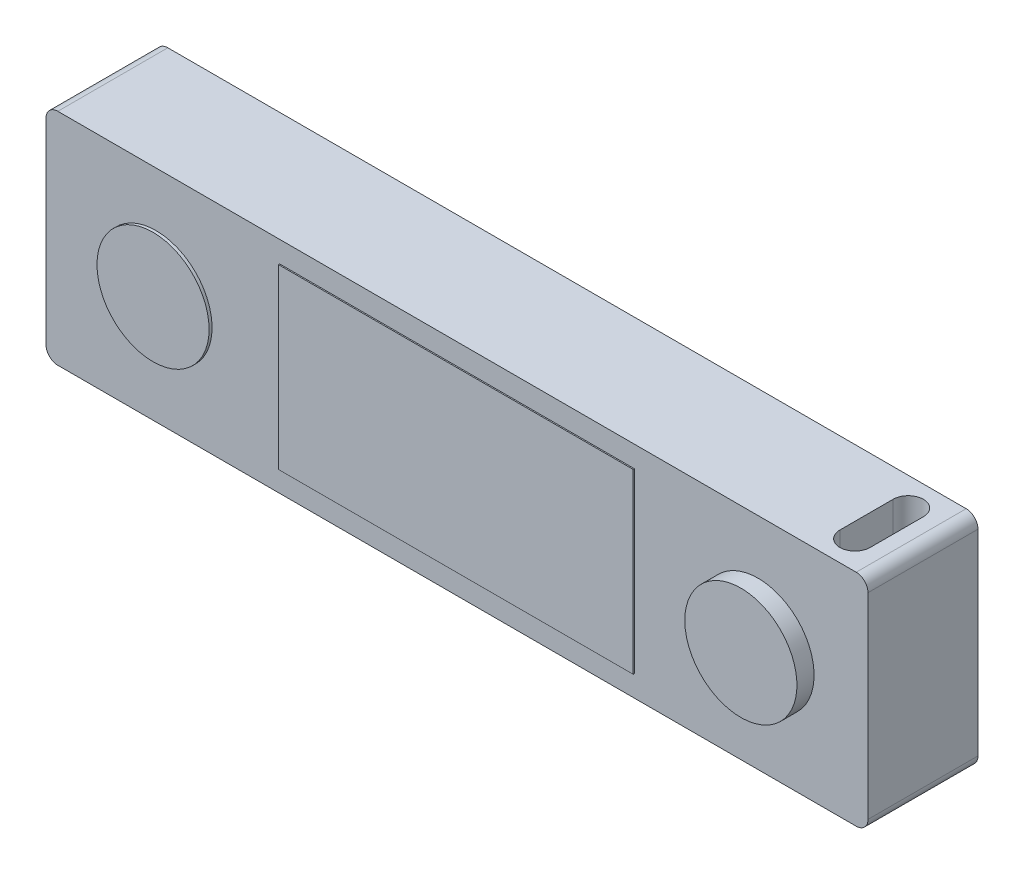
ISO-10303-21;
HEADER;
FILE_DESCRIPTION(('STEP AP214'),'2;1');
FILE_NAME('part.step','',(''),(''),'','','');
FILE_SCHEMA(('AUTOMOTIVE_DESIGN { 1 0 10303 214 1 1 1 1 }'));
ENDSEC;
DATA;
#1=APPLICATION_CONTEXT('core data for automotive mechanical design processes');
#2=APPLICATION_PROTOCOL_DEFINITION('international standard','automotive_design',2000,#1);
#3=PRODUCT_CONTEXT('',#1,'mechanical');
#4=PRODUCT('Part','Part','',(#3));
#5=PRODUCT_RELATED_PRODUCT_CATEGORY('part','',(#4));
#6=PRODUCT_DEFINITION_FORMATION('','',#4);
#7=PRODUCT_DEFINITION_CONTEXT('part definition',#1,'design');
#8=PRODUCT_DEFINITION('design','',#6,#7);
#9=PRODUCT_DEFINITION_SHAPE('','',#8);
#10=(LENGTH_UNIT() NAMED_UNIT(*) SI_UNIT(.MILLI.,.METRE.));
#11=(NAMED_UNIT(*) PLANE_ANGLE_UNIT() SI_UNIT($,.RADIAN.));
#12=(NAMED_UNIT(*) SI_UNIT($,.STERADIAN.) SOLID_ANGLE_UNIT());
#13=UNCERTAINTY_MEASURE_WITH_UNIT(LENGTH_MEASURE(1.E-05),#10,'distance_accuracy_value','');
#14=(GEOMETRIC_REPRESENTATION_CONTEXT(3) GLOBAL_UNCERTAINTY_ASSIGNED_CONTEXT((#13)) GLOBAL_UNIT_ASSIGNED_CONTEXT((#10,
#11,#12)) REPRESENTATION_CONTEXT('',''));
#15=CARTESIAN_POINT('',(0.,0.,0.));
#16=DIRECTION('',(0.,0.,1.));
#17=DIRECTION('',(1.,0.,0.));
#18=AXIS2_PLACEMENT_3D('',#15,#16,#17);
#19=CARTESIAN_POINT('',(0.,0.,9.3));
#20=DIRECTION('',(0.,0.,-1.));
#21=DIRECTION('',(-1.,0.,0.));
#22=AXIS2_PLACEMENT_3D('',#19,#20,#21);
#23=PLANE('',#22);
#24=DIRECTION('',(0.,-1.,0.));
#25=VECTOR('',#24,1.);
#26=CARTESIAN_POINT('',(-34.75,-9.3,9.3));
#27=LINE('',#26,#25);
#28=CARTESIAN_POINT('',(-34.75,8.3,9.3));
#29=VERTEX_POINT('',#28);
#30=CARTESIAN_POINT('',(-34.75,-8.3,9.3));
#31=VERTEX_POINT('',#30);
#32=EDGE_CURVE('E230',#29,#31,#27,.T.);
#33=ORIENTED_EDGE('',*,*,#32,.T.);
#34=CARTESIAN_POINT('',(-33.75,-8.3,9.3));
#35=DIRECTION('',(0.,0.,-1.));
#36=DIRECTION('',(-1.,0.,0.));
#37=AXIS2_PLACEMENT_3D('',#34,#35,#36);
#38=CIRCLE('',#37,1.);
#39=CARTESIAN_POINT('',(-33.75,-9.3,9.3));
#40=VERTEX_POINT('',#39);
#41=EDGE_CURVE('E287',#31,#40,#38,.F.);
#42=ORIENTED_EDGE('',*,*,#41,.T.);
#43=DIRECTION('',(1.,0.,0.));
#44=VECTOR('',#43,1.);
#45=CARTESIAN_POINT('',(-34.75,-9.3,9.3));
#46=LINE('',#45,#44);
#47=CARTESIAN_POINT('',(33.75,-9.3,9.3));
#48=VERTEX_POINT('',#47);
#49=EDGE_CURVE('E234',#40,#48,#46,.T.);
#50=ORIENTED_EDGE('',*,*,#49,.T.);
#51=CARTESIAN_POINT('',(33.75,-8.3,9.3));
#52=DIRECTION('',(0.,0.,-1.));
#53=DIRECTION('',(-1.,0.,0.));
#54=AXIS2_PLACEMENT_3D('',#51,#52,#53);
#55=CIRCLE('',#54,1.);
#56=CARTESIAN_POINT('',(34.75,-8.3,9.3));
#57=VERTEX_POINT('',#56);
#58=EDGE_CURVE('E282',#48,#57,#55,.F.);
#59=ORIENTED_EDGE('',*,*,#58,.T.);
#60=DIRECTION('',(0.,1.,0.));
#61=VECTOR('',#60,1.);
#62=CARTESIAN_POINT('',(34.75,-9.3,9.3));
#63=LINE('',#62,#61);
#64=CARTESIAN_POINT('',(34.75,8.3,9.3));
#65=VERTEX_POINT('',#64);
#66=EDGE_CURVE('E221',#57,#65,#63,.T.);
#67=ORIENTED_EDGE('',*,*,#66,.T.);
#68=CARTESIAN_POINT('',(33.75,8.3,9.3));
#69=DIRECTION('',(0.,0.,-1.));
#70=DIRECTION('',(-1.,0.,0.));
#71=AXIS2_PLACEMENT_3D('',#68,#69,#70);
#72=CIRCLE('',#71,1.);
#73=CARTESIAN_POINT('',(33.75,9.3,9.3));
#74=VERTEX_POINT('',#73);
#75=EDGE_CURVE('E280',#65,#74,#72,.F.);
#76=ORIENTED_EDGE('',*,*,#75,.T.);
#77=DIRECTION('',(-1.,0.,0.));
#78=VECTOR('',#77,1.);
#79=CARTESIAN_POINT('',(-34.75,9.3,9.3));
#80=LINE('',#79,#78);
#81=CARTESIAN_POINT('',(-33.75,9.3,9.3));
#82=VERTEX_POINT('',#81);
#83=EDGE_CURVE('E225',#74,#82,#80,.T.);
#84=ORIENTED_EDGE('',*,*,#83,.T.);
#85=CARTESIAN_POINT('',(-33.75,8.3,9.3));
#86=DIRECTION('',(0.,0.,-1.));
#87=DIRECTION('',(-1.,0.,0.));
#88=AXIS2_PLACEMENT_3D('',#85,#86,#87);
#89=CIRCLE('',#88,1.);
#90=EDGE_CURVE('E284',#82,#29,#89,.F.);
#91=ORIENTED_EDGE('',*,*,#90,.T.);
#92=EDGE_LOOP('',(#33,#42,#50,#59,#67,#76,#84,#91));
#93=FACE_BOUND('',#92,.T.);
#94=CARTESIAN_POINT('',(25.450020764039,-0.0239712427963362,9.3));
#95=DIRECTION('',(0.,0.,-1.));
#96=DIRECTION('',(-1.,0.,0.));
#97=AXIS2_PLACEMENT_3D('',#94,#95,#96);
#98=CIRCLE('',#97,4.74);
#99=CARTESIAN_POINT('',(20.710020764039,-0.0239712427963362,9.3));
#100=VERTEX_POINT('',#99);
#101=EDGE_CURVE('E50',#100,#100,#98,.F.);
#102=ORIENTED_EDGE('',*,*,#101,.F.);
#103=EDGE_LOOP('',(#102));
#104=FACE_BOUND('',#103,.T.);
#105=CARTESIAN_POINT('',(-25.450020764039,-0.0239712427963425,9.3));
#106=DIRECTION('',(0.,0.,-1.));
#107=DIRECTION('',(-1.,0.,0.));
#108=AXIS2_PLACEMENT_3D('',#105,#106,#107);
#109=CIRCLE('',#108,4.74);
#110=CARTESIAN_POINT('',(-30.190020764039,-0.0239712427963425,9.3));
#111=VERTEX_POINT('',#110);
#112=EDGE_CURVE('E11',#111,#111,#109,.F.);
#113=ORIENTED_EDGE('',*,*,#112,.F.);
#114=EDGE_LOOP('',(#113));
#115=FACE_BOUND('',#114,.T.);
#116=DIRECTION('',(0.,1.,0.));
#117=VECTOR('',#116,1.);
#118=CARTESIAN_POINT('',(15.,-7.5,9.3));
#119=LINE('',#118,#117);
#120=CARTESIAN_POINT('',(15.,-7.5,9.3));
#121=VERTEX_POINT('',#120);
#122=CARTESIAN_POINT('',(15.,7.5,9.3));
#123=VERTEX_POINT('',#122);
#124=EDGE_CURVE('E181',#121,#123,#119,.T.);
#125=ORIENTED_EDGE('',*,*,#124,.F.);
#126=DIRECTION('',(1.,0.,0.));
#127=VECTOR('',#126,1.);
#128=CARTESIAN_POINT('',(-15.,-7.5,9.3));
#129=LINE('',#128,#127);
#130=CARTESIAN_POINT('',(-15.,-7.5,9.3));
#131=VERTEX_POINT('',#130);
#132=EDGE_CURVE('E178',#131,#121,#129,.T.);
#133=ORIENTED_EDGE('',*,*,#132,.F.);
#134=DIRECTION('',(0.,-1.,0.));
#135=VECTOR('',#134,1.);
#136=CARTESIAN_POINT('',(-15.,-7.5,9.3));
#137=LINE('',#136,#135);
#138=CARTESIAN_POINT('',(-15.,7.5,9.3));
#139=VERTEX_POINT('',#138);
#140=EDGE_CURVE('E65',#139,#131,#137,.T.);
#141=ORIENTED_EDGE('',*,*,#140,.F.);
#142=DIRECTION('',(-1.,0.,0.));
#143=VECTOR('',#142,1.);
#144=CARTESIAN_POINT('',(-15.,7.5,9.3));
#145=LINE('',#144,#143);
#146=EDGE_CURVE('E57',#123,#139,#145,.T.);
#147=ORIENTED_EDGE('',*,*,#146,.F.);
#148=EDGE_LOOP('',(#125,#133,#141,#147));
#149=FACE_BOUND('',#148,.T.);
#150=ADVANCED_FACE('F41',(#93,#104,#115,#149),#23,.F.);
#151=CARTESIAN_POINT('',(34.75,-9.3,9.3));
#152=DIRECTION('',(-1.,0.,0.));
#153=DIRECTION('',(0.,0.,1.));
#154=AXIS2_PLACEMENT_3D('',#151,#152,#153);
#155=PLANE('',#154);
#156=ORIENTED_EDGE('',*,*,#66,.F.);
#157=DIRECTION('',(0.,0.,-1.));
#158=VECTOR('',#157,1.);
#159=CARTESIAN_POINT('',(34.75,-8.3,9.3));
#160=LINE('',#159,#158);
#161=CARTESIAN_POINT('',(34.75,-8.3,0.));
#162=VERTEX_POINT('',#161);
#163=EDGE_CURVE('E298',#57,#162,#160,.T.);
#164=ORIENTED_EDGE('',*,*,#163,.T.);
#165=DIRECTION('',(0.,1.,0.));
#166=VECTOR('',#165,1.);
#167=CARTESIAN_POINT('',(34.75,-9.3,0.));
#168=LINE('',#167,#166);
#169=CARTESIAN_POINT('',(34.75,8.3,0.));
#170=VERTEX_POINT('',#169);
#171=EDGE_CURVE('E239',#162,#170,#168,.T.);
#172=ORIENTED_EDGE('',*,*,#171,.T.);
#173=DIRECTION('',(0.,0.,-1.));
#174=VECTOR('',#173,1.);
#175=CARTESIAN_POINT('',(34.75,8.3,9.3));
#176=LINE('',#175,#174);
#177=EDGE_CURVE('E296',#170,#65,#176,.F.);
#178=ORIENTED_EDGE('',*,*,#177,.T.);
#179=EDGE_LOOP('',(#156,#164,#172,#178));
#180=FACE_BOUND('',#179,.T.);
#181=ADVANCED_FACE('F307',(#180),#155,.F.);
#182=CARTESIAN_POINT('',(-34.75,9.3,9.3));
#183=DIRECTION('',(0.,-1.,0.));
#184=DIRECTION('',(0.,0.,-1.));
#185=AXIS2_PLACEMENT_3D('',#182,#183,#184);
#186=PLANE('',#185);
#187=DIRECTION('',(0.,0.,-1.));
#188=VECTOR('',#187,1.);
#189=CARTESIAN_POINT('',(32.5301538897026,9.3,6.90064543561231));
#190=LINE('',#189,#188);
#191=CARTESIAN_POINT('',(32.5301538897026,9.3,6.90064543561231));
#192=VERTEX_POINT('',#191);
#193=CARTESIAN_POINT('',(32.5301538897026,9.3,2.39935456438769));
#194=VERTEX_POINT('',#193);
#195=EDGE_CURVE('E215',#192,#194,#190,.T.);
#196=ORIENTED_EDGE('',*,*,#195,.F.);
#197=CARTESIAN_POINT('',(31.2506764705896,9.3,6.90064543561231));
#198=DIRECTION('',(0.,1.,0.));
#199=DIRECTION('',(0.,0.,1.));
#200=AXIS2_PLACEMENT_3D('',#197,#198,#199);
#201=CIRCLE('',#200,1.279477419113);
#202=CARTESIAN_POINT('',(29.9711990514766,9.3,6.90064543561231));
#203=VERTEX_POINT('',#202);
#204=EDGE_CURVE('E244',#203,#192,#201,.T.);
#205=ORIENTED_EDGE('',*,*,#204,.F.);
#206=DIRECTION('',(0.,0.,1.));
#207=VECTOR('',#206,1.);
#208=CARTESIAN_POINT('',(29.9711990514766,9.3,6.90064543561231));
#209=LINE('',#208,#207);
#210=CARTESIAN_POINT('',(29.9711990514766,9.3,2.39935456438769));
#211=VERTEX_POINT('',#210);
#212=EDGE_CURVE('E257',#211,#203,#209,.T.);
#213=ORIENTED_EDGE('',*,*,#212,.F.);
#214=CARTESIAN_POINT('',(31.2506764705896,9.3,2.39935456438769));
#215=DIRECTION('',(0.,1.,0.));
#216=DIRECTION('',(0.,0.,1.));
#217=AXIS2_PLACEMENT_3D('',#214,#215,#216);
#218=CIRCLE('',#217,1.279477419113);
#219=EDGE_CURVE('E255',#194,#211,#218,.T.);
#220=ORIENTED_EDGE('',*,*,#219,.F.);
#221=EDGE_LOOP('',(#196,#205,#213,#220));
#222=FACE_BOUND('',#221,.T.);
#223=DIRECTION('',(-1.,0.,0.));
#224=VECTOR('',#223,1.);
#225=CARTESIAN_POINT('',(-34.75,9.3,0.));
#226=LINE('',#225,#224);
#227=CARTESIAN_POINT('',(33.75,9.3,0.));
#228=VERTEX_POINT('',#227);
#229=CARTESIAN_POINT('',(-33.75,9.3,0.));
#230=VERTEX_POINT('',#229);
#231=EDGE_CURVE('E243',#228,#230,#226,.T.);
#232=ORIENTED_EDGE('',*,*,#231,.T.);
#233=DIRECTION('',(0.,0.,-1.));
#234=VECTOR('',#233,1.);
#235=CARTESIAN_POINT('',(-33.75,9.3,9.3));
#236=LINE('',#235,#234);
#237=EDGE_CURVE('E293',#230,#82,#236,.F.);
#238=ORIENTED_EDGE('',*,*,#237,.T.);
#239=ORIENTED_EDGE('',*,*,#83,.F.);
#240=DIRECTION('',(0.,0.,-1.));
#241=VECTOR('',#240,1.);
#242=CARTESIAN_POINT('',(33.75,9.3,9.3));
#243=LINE('',#242,#241);
#244=EDGE_CURVE('E290',#74,#228,#243,.T.);
#245=ORIENTED_EDGE('',*,*,#244,.T.);
#246=EDGE_LOOP('',(#232,#238,#239,#245));
#247=FACE_BOUND('',#246,.T.);
#248=ADVANCED_FACE('F384',(#222,#247),#186,.F.);
#249=CARTESIAN_POINT('',(-34.75,-9.3,9.3));
#250=DIRECTION('',(1.,0.,0.));
#251=DIRECTION('',(0.,0.,-1.));
#252=AXIS2_PLACEMENT_3D('',#249,#250,#251);
#253=PLANE('',#252);
#254=DIRECTION('',(0.,-1.,0.));
#255=VECTOR('',#254,1.);
#256=CARTESIAN_POINT('',(-34.75,-9.3,0.));
#257=LINE('',#256,#255);
#258=CARTESIAN_POINT('',(-34.75,8.3,0.));
#259=VERTEX_POINT('',#258);
#260=CARTESIAN_POINT('',(-34.75,-8.3,0.));
#261=VERTEX_POINT('',#260);
#262=EDGE_CURVE('E248',#259,#261,#257,.T.);
#263=ORIENTED_EDGE('',*,*,#262,.T.);
#264=DIRECTION('',(0.,0.,-1.));
#265=VECTOR('',#264,1.);
#266=CARTESIAN_POINT('',(-34.75,-8.3,9.3));
#267=LINE('',#266,#265);
#268=EDGE_CURVE('E278',#261,#31,#267,.F.);
#269=ORIENTED_EDGE('',*,*,#268,.T.);
#270=ORIENTED_EDGE('',*,*,#32,.F.);
#271=DIRECTION('',(0.,0.,-1.));
#272=VECTOR('',#271,1.);
#273=CARTESIAN_POINT('',(-34.75,8.3,9.3));
#274=LINE('',#273,#272);
#275=EDGE_CURVE('E275',#29,#259,#274,.T.);
#276=ORIENTED_EDGE('',*,*,#275,.T.);
#277=EDGE_LOOP('',(#263,#269,#270,#276));
#278=FACE_BOUND('',#277,.T.);
#279=ADVANCED_FACE('F380',(#278),#253,.F.);
#280=CARTESIAN_POINT('',(-34.75,-9.3,9.3));
#281=DIRECTION('',(0.,1.,0.));
#282=DIRECTION('',(0.,0.,1.));
#283=AXIS2_PLACEMENT_3D('',#280,#281,#282);
#284=PLANE('',#283);
#285=DIRECTION('',(0.,0.,1.));
#286=VECTOR('',#285,1.);
#287=CARTESIAN_POINT('',(29.9711990514766,-9.3,6.90064543561231));
#288=LINE('',#287,#286);
#289=CARTESIAN_POINT('',(29.9711990514766,-9.3,2.39935456438769));
#290=VERTEX_POINT('',#289);
#291=CARTESIAN_POINT('',(29.9711990514766,-9.3,6.90064543561231));
#292=VERTEX_POINT('',#291);
#293=EDGE_CURVE('E204',#290,#292,#288,.T.);
#294=ORIENTED_EDGE('',*,*,#293,.T.);
#295=CARTESIAN_POINT('',(31.2506764705896,-9.3,6.90064543561231));
#296=DIRECTION('',(0.,1.,0.));
#297=DIRECTION('',(0.,0.,1.));
#298=AXIS2_PLACEMENT_3D('',#295,#296,#297);
#299=CIRCLE('',#298,1.279477419113);
#300=CARTESIAN_POINT('',(32.5301538897026,-9.3,6.90064543561231));
#301=VERTEX_POINT('',#300);
#302=EDGE_CURVE('E195',#292,#301,#299,.T.);
#303=ORIENTED_EDGE('',*,*,#302,.T.);
#304=DIRECTION('',(0.,0.,-1.));
#305=VECTOR('',#304,1.);
#306=CARTESIAN_POINT('',(32.5301538897026,-9.3,6.90064543561231));
#307=LINE('',#306,#305);
#308=CARTESIAN_POINT('',(32.5301538897026,-9.3,2.39935456438769));
#309=VERTEX_POINT('',#308);
#310=EDGE_CURVE('E198',#301,#309,#307,.T.);
#311=ORIENTED_EDGE('',*,*,#310,.T.);
#312=CARTESIAN_POINT('',(31.2506764705896,-9.3,2.39935456438769));
#313=DIRECTION('',(0.,1.,0.));
#314=DIRECTION('',(0.,0.,1.));
#315=AXIS2_PLACEMENT_3D('',#312,#313,#314);
#316=CIRCLE('',#315,1.279477419113);
#317=EDGE_CURVE('E201',#309,#290,#316,.T.);
#318=ORIENTED_EDGE('',*,*,#317,.T.);
#319=EDGE_LOOP('',(#294,#303,#311,#318));
#320=FACE_BOUND('',#319,.T.);
#321=ORIENTED_EDGE('',*,*,#49,.F.);
#322=DIRECTION('',(0.,0.,-1.));
#323=VECTOR('',#322,1.);
#324=CARTESIAN_POINT('',(-33.75,-9.3,9.3));
#325=LINE('',#324,#323);
#326=CARTESIAN_POINT('',(-33.75,-9.3,0.));
#327=VERTEX_POINT('',#326);
#328=EDGE_CURVE('E262',#40,#327,#325,.T.);
#329=ORIENTED_EDGE('',*,*,#328,.T.);
#330=DIRECTION('',(1.,0.,0.));
#331=VECTOR('',#330,1.);
#332=CARTESIAN_POINT('',(-34.75,-9.3,0.));
#333=LINE('',#332,#331);
#334=CARTESIAN_POINT('',(33.75,-9.3,0.));
#335=VERTEX_POINT('',#334);
#336=EDGE_CURVE('E226',#327,#335,#333,.T.);
#337=ORIENTED_EDGE('',*,*,#336,.T.);
#338=DIRECTION('',(0.,0.,-1.));
#339=VECTOR('',#338,1.);
#340=CARTESIAN_POINT('',(33.75,-9.3,9.3));
#341=LINE('',#340,#339);
#342=EDGE_CURVE('E238',#335,#48,#341,.F.);
#343=ORIENTED_EDGE('',*,*,#342,.T.);
#344=EDGE_LOOP('',(#321,#329,#337,#343));
#345=FACE_BOUND('',#344,.T.);
#346=ADVANCED_FACE('F376',(#320,#345),#284,.F.);
#347=CARTESIAN_POINT('',(0.,0.,0.));
#348=DIRECTION('',(0.,0.,-1.));
#349=DIRECTION('',(-1.,0.,0.));
#350=AXIS2_PLACEMENT_3D('',#347,#348,#349);
#351=PLANE('',#350);
#352=ORIENTED_EDGE('',*,*,#336,.F.);
#353=CARTESIAN_POINT('',(-33.75,-8.3,0.));
#354=DIRECTION('',(0.,0.,-1.));
#355=DIRECTION('',(-1.,0.,0.));
#356=AXIS2_PLACEMENT_3D('',#353,#354,#355);
#357=CIRCLE('',#356,1.);
#358=EDGE_CURVE('E273',#327,#261,#357,.T.);
#359=ORIENTED_EDGE('',*,*,#358,.T.);
#360=ORIENTED_EDGE('',*,*,#262,.F.);
#361=CARTESIAN_POINT('',(-33.75,8.3,0.));
#362=DIRECTION('',(0.,0.,-1.));
#363=DIRECTION('',(-1.,0.,0.));
#364=AXIS2_PLACEMENT_3D('',#361,#362,#363);
#365=CIRCLE('',#364,1.);
#366=EDGE_CURVE('E270',#259,#230,#365,.T.);
#367=ORIENTED_EDGE('',*,*,#366,.T.);
#368=ORIENTED_EDGE('',*,*,#231,.F.);
#369=CARTESIAN_POINT('',(33.75,8.3,0.));
#370=DIRECTION('',(0.,0.,-1.));
#371=DIRECTION('',(-1.,0.,0.));
#372=AXIS2_PLACEMENT_3D('',#369,#370,#371);
#373=CIRCLE('',#372,1.);
#374=EDGE_CURVE('E266',#228,#170,#373,.T.);
#375=ORIENTED_EDGE('',*,*,#374,.T.);
#376=ORIENTED_EDGE('',*,*,#171,.F.);
#377=CARTESIAN_POINT('',(33.75,-8.3,0.));
#378=DIRECTION('',(0.,0.,-1.));
#379=DIRECTION('',(-1.,0.,0.));
#380=AXIS2_PLACEMENT_3D('',#377,#378,#379);
#381=CIRCLE('',#380,1.);
#382=EDGE_CURVE('E268',#162,#335,#381,.T.);
#383=ORIENTED_EDGE('',*,*,#382,.T.);
#384=EDGE_LOOP('',(#352,#359,#360,#367,#368,#375,#376,#383));
#385=FACE_BOUND('',#384,.T.);
#386=ADVANCED_FACE('F371',(#385),#351,.T.);
#387=CARTESIAN_POINT('',(31.2506764705896,-9.3,6.90064543561231));
#388=DIRECTION('',(0.,1.,0.));
#389=DIRECTION('',(0.,0.,1.));
#390=AXIS2_PLACEMENT_3D('',#387,#388,#389);
#391=CYLINDRICAL_SURFACE('',#390,1.279477419113);
#392=DIRECTION('',(0.,1.,0.));
#393=VECTOR('',#392,1.);
#394=CARTESIAN_POINT('',(32.5301538897026,-9.3,6.90064543561231));
#395=LINE('',#394,#393);
#396=EDGE_CURVE('E207',#301,#192,#395,.T.);
#397=ORIENTED_EDGE('',*,*,#396,.F.);
#398=ORIENTED_EDGE('',*,*,#302,.F.);
#399=DIRECTION('',(0.,1.,0.));
#400=VECTOR('',#399,1.);
#401=CARTESIAN_POINT('',(29.9711990514766,-9.3,6.90064543561231));
#402=LINE('',#401,#400);
#403=EDGE_CURVE('E211',#292,#203,#402,.T.);
#404=ORIENTED_EDGE('',*,*,#403,.T.);
#405=ORIENTED_EDGE('',*,*,#204,.T.);
#406=EDGE_LOOP('',(#397,#398,#404,#405));
#407=FACE_BOUND('',#406,.T.);
#408=ADVANCED_FACE('F360',(#407),#391,.F.);
#409=CARTESIAN_POINT('',(29.9711990514766,-9.3,6.90064543561231));
#410=DIRECTION('',(-1.,0.,0.));
#411=DIRECTION('',(0.,0.,1.));
#412=AXIS2_PLACEMENT_3D('',#409,#410,#411);
#413=PLANE('',#412);
#414=ORIENTED_EDGE('',*,*,#403,.F.);
#415=ORIENTED_EDGE('',*,*,#293,.F.);
#416=DIRECTION('',(0.,1.,0.));
#417=VECTOR('',#416,1.);
#418=CARTESIAN_POINT('',(29.9711990514766,-9.3,2.39935456438769));
#419=LINE('',#418,#417);
#420=EDGE_CURVE('E208',#290,#211,#419,.T.);
#421=ORIENTED_EDGE('',*,*,#420,.T.);
#422=ORIENTED_EDGE('',*,*,#212,.T.);
#423=EDGE_LOOP('',(#414,#415,#421,#422));
#424=FACE_BOUND('',#423,.T.);
#425=ADVANCED_FACE('F356',(#424),#413,.F.);
#426=CARTESIAN_POINT('',(31.2506764705896,-9.3,2.39935456438769));
#427=DIRECTION('',(0.,1.,0.));
#428=DIRECTION('',(0.,0.,1.));
#429=AXIS2_PLACEMENT_3D('',#426,#427,#428);
#430=CYLINDRICAL_SURFACE('',#429,1.279477419113);
#431=ORIENTED_EDGE('',*,*,#420,.F.);
#432=ORIENTED_EDGE('',*,*,#317,.F.);
#433=DIRECTION('',(0.,1.,0.));
#434=VECTOR('',#433,1.);
#435=CARTESIAN_POINT('',(32.5301538897026,-9.3,2.39935456438769));
#436=LINE('',#435,#434);
#437=EDGE_CURVE('E212',#309,#194,#436,.T.);
#438=ORIENTED_EDGE('',*,*,#437,.T.);
#439=ORIENTED_EDGE('',*,*,#219,.T.);
#440=EDGE_LOOP('',(#431,#432,#438,#439));
#441=FACE_BOUND('',#440,.T.);
#442=ADVANCED_FACE('F359',(#441),#430,.F.);
#443=CARTESIAN_POINT('',(32.5301538897026,-9.3,6.90064543561231));
#444=DIRECTION('',(1.,0.,0.));
#445=DIRECTION('',(0.,0.,-1.));
#446=AXIS2_PLACEMENT_3D('',#443,#444,#445);
#447=PLANE('',#446);
#448=ORIENTED_EDGE('',*,*,#437,.F.);
#449=ORIENTED_EDGE('',*,*,#310,.F.);
#450=ORIENTED_EDGE('',*,*,#396,.T.);
#451=ORIENTED_EDGE('',*,*,#195,.T.);
#452=EDGE_LOOP('',(#448,#449,#450,#451));
#453=FACE_BOUND('',#452,.T.);
#454=ADVANCED_FACE('F364',(#453),#447,.F.);
#455=CARTESIAN_POINT('',(-33.75,-8.3,9.3));
#456=DIRECTION('',(0.,0.,-1.));
#457=DIRECTION('',(-1.,0.,0.));
#458=AXIS2_PLACEMENT_3D('',#455,#456,#457);
#459=CYLINDRICAL_SURFACE('',#458,1.);
#460=ORIENTED_EDGE('',*,*,#41,.F.);
#461=ORIENTED_EDGE('',*,*,#268,.F.);
#462=ORIENTED_EDGE('',*,*,#358,.F.);
#463=ORIENTED_EDGE('',*,*,#328,.F.);
#464=EDGE_LOOP('',(#460,#461,#462,#463));
#465=FACE_BOUND('',#464,.T.);
#466=ADVANCED_FACE('F368',(#465),#459,.T.);
#467=CARTESIAN_POINT('',(-33.75,8.3,9.3));
#468=DIRECTION('',(0.,0.,-1.));
#469=DIRECTION('',(-1.,0.,0.));
#470=AXIS2_PLACEMENT_3D('',#467,#468,#469);
#471=CYLINDRICAL_SURFACE('',#470,1.);
#472=ORIENTED_EDGE('',*,*,#90,.F.);
#473=ORIENTED_EDGE('',*,*,#237,.F.);
#474=ORIENTED_EDGE('',*,*,#366,.F.);
#475=ORIENTED_EDGE('',*,*,#275,.F.);
#476=EDGE_LOOP('',(#472,#473,#474,#475));
#477=FACE_BOUND('',#476,.T.);
#478=ADVANCED_FACE('F394',(#477),#471,.T.);
#479=CARTESIAN_POINT('',(33.75,-8.3,9.3));
#480=DIRECTION('',(0.,0.,-1.));
#481=DIRECTION('',(-1.,0.,0.));
#482=AXIS2_PLACEMENT_3D('',#479,#480,#481);
#483=CYLINDRICAL_SURFACE('',#482,1.);
#484=ORIENTED_EDGE('',*,*,#58,.F.);
#485=ORIENTED_EDGE('',*,*,#342,.F.);
#486=ORIENTED_EDGE('',*,*,#382,.F.);
#487=ORIENTED_EDGE('',*,*,#163,.F.);
#488=EDGE_LOOP('',(#484,#485,#486,#487));
#489=FACE_BOUND('',#488,.T.);
#490=ADVANCED_FACE('F397',(#489),#483,.T.);
#491=CARTESIAN_POINT('',(33.75,8.3,9.3));
#492=DIRECTION('',(0.,0.,-1.));
#493=DIRECTION('',(-1.,0.,0.));
#494=AXIS2_PLACEMENT_3D('',#491,#492,#493);
#495=CYLINDRICAL_SURFACE('',#494,1.);
#496=ORIENTED_EDGE('',*,*,#75,.F.);
#497=ORIENTED_EDGE('',*,*,#177,.F.);
#498=ORIENTED_EDGE('',*,*,#374,.F.);
#499=ORIENTED_EDGE('',*,*,#244,.F.);
#500=EDGE_LOOP('',(#496,#497,#498,#499));
#501=FACE_BOUND('',#500,.T.);
#502=ADVANCED_FACE('F43',(#501),#495,.T.);
#503=CARTESIAN_POINT('',(25.450020764039,-0.0239712427963362,24.1567445712969));
#504=DIRECTION('',(0.,0.,-1.));
#505=DIRECTION('',(-1.,0.,0.));
#506=AXIS2_PLACEMENT_3D('',#503,#504,#505);
#507=CYLINDRICAL_SURFACE('',#506,4.74);
#508=CARTESIAN_POINT('',(25.450020764039,-0.0239712427963362,10.75));
#509=DIRECTION('',(0.,0.,-1.));
#510=DIRECTION('',(0.,1.,0.));
#511=AXIS2_PLACEMENT_3D('',#508,#509,#510);
#512=CIRCLE('',#511,4.74);
#513=CARTESIAN_POINT('',(20.710020764039,-0.0239712427963362,10.75));
#514=VERTEX_POINT('',#513);
#515=EDGE_CURVE('E186',#514,#514,#512,.T.);
#516=CARTESIAN_POINT('',(20.710020764039,-0.0239712427963362,10.75));
#517=CARTESIAN_POINT('',(20.710020764039,-0.0239712427963362,10.7348958333333));
#518=CARTESIAN_POINT('',(20.710020764039,-0.0239712427963362,10.7197916666667));
#519=CARTESIAN_POINT('',(20.710020764039,-0.0239712427963362,10.6895833333333));
#520=CARTESIAN_POINT('',(20.710020764039,-0.0239712427963362,10.6744791666667));
#521=CARTESIAN_POINT('',(20.710020764039,-0.0239712427963362,10.6442708333333));
#522=CARTESIAN_POINT('',(20.710020764039,-0.0239712427963362,10.6291666666667));
#523=CARTESIAN_POINT('',(20.710020764039,-0.0239712427963362,10.5989583333333));
#524=CARTESIAN_POINT('',(20.710020764039,-0.0239712427963362,10.5838541666667));
#525=CARTESIAN_POINT('',(20.710020764039,-0.0239712427963362,10.5536458333333));
#526=CARTESIAN_POINT('',(20.710020764039,-0.0239712427963362,10.5385416666667));
#527=CARTESIAN_POINT('',(20.710020764039,-0.0239712427963362,10.5083333333333));
#528=CARTESIAN_POINT('',(20.710020764039,-0.0239712427963362,10.4932291666667));
#529=CARTESIAN_POINT('',(20.710020764039,-0.0239712427963362,10.4630208333333));
#530=CARTESIAN_POINT('',(20.710020764039,-0.0239712427963362,10.4479166666667));
#531=CARTESIAN_POINT('',(20.710020764039,-0.0239712427963362,10.4177083333333));
#532=CARTESIAN_POINT('',(20.710020764039,-0.0239712427963362,10.4026041666667));
#533=CARTESIAN_POINT('',(20.710020764039,-0.0239712427963362,10.3723958333333));
#534=CARTESIAN_POINT('',(20.710020764039,-0.0239712427963362,10.3572916666667));
#535=CARTESIAN_POINT('',(20.710020764039,-0.0239712427963362,10.3270833333333));
#536=CARTESIAN_POINT('',(20.710020764039,-0.0239712427963362,10.3119791666667));
#537=CARTESIAN_POINT('',(20.710020764039,-0.0239712427963362,10.2817708333333));
#538=CARTESIAN_POINT('',(20.710020764039,-0.0239712427963362,10.2666666666667));
#539=CARTESIAN_POINT('',(20.710020764039,-0.0239712427963362,10.2364583333333));
#540=CARTESIAN_POINT('',(20.710020764039,-0.0239712427963362,10.2213541666667));
#541=CARTESIAN_POINT('',(20.710020764039,-0.0239712427963362,10.1911458333333));
#542=CARTESIAN_POINT('',(20.710020764039,-0.0239712427963362,10.1760416666667));
#543=CARTESIAN_POINT('',(20.710020764039,-0.0239712427963362,10.1458333333333));
#544=CARTESIAN_POINT('',(20.710020764039,-0.0239712427963362,10.1307291666667));
#545=CARTESIAN_POINT('',(20.710020764039,-0.0239712427963362,10.1005208333333));
#546=CARTESIAN_POINT('',(20.710020764039,-0.0239712427963362,10.0854166666667));
#547=CARTESIAN_POINT('',(20.710020764039,-0.0239712427963362,10.0552083333333));
#548=CARTESIAN_POINT('',(20.710020764039,-0.0239712427963362,10.0401041666667));
#549=CARTESIAN_POINT('',(20.710020764039,-0.0239712427963362,10.0098958333333));
#550=CARTESIAN_POINT('',(20.710020764039,-0.0239712427963362,9.99479166666667));
#551=CARTESIAN_POINT('',(20.710020764039,-0.0239712427963362,9.96458333333333));
#552=CARTESIAN_POINT('',(20.710020764039,-0.0239712427963362,9.94947916666666));
#553=CARTESIAN_POINT('',(20.710020764039,-0.0239712427963362,9.91927083333333));
#554=CARTESIAN_POINT('',(20.710020764039,-0.0239712427963362,9.90416666666667));
#555=CARTESIAN_POINT('',(20.710020764039,-0.0239712427963362,9.87395833333333));
#556=CARTESIAN_POINT('',(20.710020764039,-0.0239712427963362,9.85885416666667));
#557=CARTESIAN_POINT('',(20.710020764039,-0.0239712427963362,9.82864583333333));
#558=CARTESIAN_POINT('',(20.710020764039,-0.0239712427963362,9.81354166666667));
#559=CARTESIAN_POINT('',(20.710020764039,-0.0239712427963362,9.78333333333333));
#560=CARTESIAN_POINT('',(20.710020764039,-0.0239712427963362,9.76822916666667));
#561=CARTESIAN_POINT('',(20.710020764039,-0.0239712427963362,9.73802083333333));
#562=CARTESIAN_POINT('',(20.710020764039,-0.0239712427963362,9.72291666666667));
#563=CARTESIAN_POINT('',(20.710020764039,-0.0239712427963362,9.69270833333333));
#564=CARTESIAN_POINT('',(20.710020764039,-0.0239712427963362,9.67760416666667));
#565=CARTESIAN_POINT('',(20.710020764039,-0.0239712427963362,9.64739583333333));
#566=CARTESIAN_POINT('',(20.710020764039,-0.0239712427963362,9.63229166666667));
#567=CARTESIAN_POINT('',(20.710020764039,-0.0239712427963362,9.60208333333333));
#568=CARTESIAN_POINT('',(20.710020764039,-0.0239712427963362,9.58697916666667));
#569=CARTESIAN_POINT('',(20.710020764039,-0.0239712427963362,9.55677083333333));
#570=CARTESIAN_POINT('',(20.710020764039,-0.0239712427963362,9.54166666666667));
#571=CARTESIAN_POINT('',(20.710020764039,-0.0239712427963362,9.51145833333333));
#572=CARTESIAN_POINT('',(20.710020764039,-0.0239712427963362,9.49635416666667));
#573=CARTESIAN_POINT('',(20.710020764039,-0.0239712427963362,9.46614583333333));
#574=CARTESIAN_POINT('',(20.710020764039,-0.0239712427963362,9.45104166666667));
#575=CARTESIAN_POINT('',(20.710020764039,-0.0239712427963362,9.42083333333333));
#576=CARTESIAN_POINT('',(20.710020764039,-0.0239712427963362,9.40572916666667));
#577=CARTESIAN_POINT('',(20.710020764039,-0.0239712427963362,9.37552083333333));
#578=CARTESIAN_POINT('',(20.710020764039,-0.0239712427963362,9.36041666666667));
#579=CARTESIAN_POINT('',(20.710020764039,-0.0239712427963362,9.33020833333333));
#580=CARTESIAN_POINT('',(20.710020764039,-0.0239712427963362,9.31510416666667));
#581=CARTESIAN_POINT('',(20.710020764039,-0.0239712427963362,9.3));
#582=B_SPLINE_CURVE_WITH_KNOTS('',3,(#516,#517,#518,#519,#520,#521,#522,#523,#524,#525,#526,
#527,#528,#529,#530,#531,#532,#533,#534,#535,#536,#537,#538,#539,#540,#541,#542,#543,#544,#545,
#546,#547,#548,#549,#550,#551,#552,#553,#554,#555,#556,#557,#558,#559,#560,#561,#562,#563,#564,
#565,#566,#567,#568,#569,#570,#571,#572,#573,#574,#575,#576,#577,#578,#579,#580,#581),
.UNSPECIFIED.,.F.,.F.,(4,2,2,2,2,2,2,2,2,2,2,2,2,2,2,2,2,2,2,2,2,2,2,2,2,2,2,2,2,2,2,2,4),(0.,
0.0453125000000002,0.0906250000000004,0.135937499999999,0.181249999999999,0.226562499999999,
0.271875,0.3171875,0.362499999999998,0.407812499999998,0.453124999999999,0.498437499999999,
0.543749999999999,0.589062499999999,0.634374999999998,0.679687499999998,0.724999999999998,
0.770312499999998,0.815624999999999,0.860937499999997,0.906249999999997,0.951562499999998,
0.996874999999998,1.0421875,1.0875,1.1328125,1.178125,1.2234375,1.26875,1.3140625,1.359375,
1.4046875,1.45),.UNSPECIFIED.);
#583=EDGE_CURVE('BSEAM303',#514,#100,#582,.T.);
#584=ORIENTED_EDGE('',*,*,#515,.T.);
#585=ORIENTED_EDGE('',*,*,#101,.T.);
#586=ORIENTED_EDGE('',*,*,#583,.T.);
#587=ORIENTED_EDGE('',*,*,#583,.F.);
#588=EDGE_LOOP('',(#584,#586,#585,#587));
#589=FACE_BOUND('',#588,.T.);
#590=ADVANCED_FACE('F303',(#589),#507,.T.);
#591=CARTESIAN_POINT('',(-36.749979235961,-9.35251242586715,10.75));
#592=DIRECTION('',(0.,0.,-1.));
#593=DIRECTION('',(0.,1.,0.));
#594=AXIS2_PLACEMENT_3D('',#591,#592,#593);
#595=PLANE('',#594);
#596=ORIENTED_EDGE('',*,*,#515,.F.);
#597=EDGE_LOOP('',(#596));
#598=FACE_BOUND('',#597,.T.);
#599=ADVANCED_FACE('F348',(#598),#595,.F.);
#600=CARTESIAN_POINT('',(-25.450020764039,-0.0239712427963425,9.55));
#601=DIRECTION('',(0.,0.,-1.));
#602=DIRECTION('',(-1.,0.,0.));
#603=AXIS2_PLACEMENT_3D('',#600,#601,#602);
#604=CYLINDRICAL_SURFACE('',#603,4.74);
#605=CARTESIAN_POINT('',(-25.450020764039,-0.0239712427963425,9.55));
#606=DIRECTION('',(0.,0.,1.));
#607=DIRECTION('',(1.,0.,0.));
#608=AXIS2_PLACEMENT_3D('',#605,#606,#607);
#609=CIRCLE('',#608,4.74);
#610=CARTESIAN_POINT('',(-20.710020764039,-0.0239712427963425,9.55));
#611=VERTEX_POINT('',#610);
#612=EDGE_CURVE('E182',#611,#611,#609,.T.);
#613=ORIENTED_EDGE('',*,*,#612,.F.);
#614=EDGE_LOOP('',(#613));
#615=FACE_BOUND('',#614,.T.);
#616=ORIENTED_EDGE('',*,*,#112,.T.);
#617=EDGE_LOOP('',(#616));
#618=FACE_BOUND('',#617,.T.);
#619=ADVANCED_FACE('F344',(#615,#618),#604,.T.);
#620=CARTESIAN_POINT('',(-25.450020764039,-0.0239712427963425,9.55));
#621=DIRECTION('',(0.,0.,1.));
#622=DIRECTION('',(1.,0.,0.));
#623=AXIS2_PLACEMENT_3D('',#620,#621,#622);
#624=PLANE('',#623);
#625=ORIENTED_EDGE('',*,*,#612,.T.);
#626=EDGE_LOOP('',(#625));
#627=FACE_BOUND('',#626,.T.);
#628=ADVANCED_FACE('F341',(#627),#624,.T.);
#629=CARTESIAN_POINT('',(15.,-7.5,9.4));
#630=DIRECTION('',(-1.,0.,0.));
#631=DIRECTION('',(0.,0.,1.));
#632=AXIS2_PLACEMENT_3D('',#629,#630,#631);
#633=PLANE('',#632);
#634=ORIENTED_EDGE('',*,*,#124,.T.);
#635=DIRECTION('',(0.,0.,-1.));
#636=VECTOR('',#635,1.);
#637=CARTESIAN_POINT('',(15.,7.5,9.4));
#638=LINE('',#637,#636);
#639=CARTESIAN_POINT('',(15.,7.5,9.4));
#640=VERTEX_POINT('',#639);
#641=EDGE_CURVE('E161',#640,#123,#638,.T.);
#642=ORIENTED_EDGE('',*,*,#641,.F.);
#643=DIRECTION('',(0.,1.,0.));
#644=VECTOR('',#643,1.);
#645=CARTESIAN_POINT('',(15.,-7.5,9.4));
#646=LINE('',#645,#644);
#647=CARTESIAN_POINT('',(15.,-7.5,9.4));
#648=VERTEX_POINT('',#647);
#649=EDGE_CURVE('E169',#648,#640,#646,.T.);
#650=ORIENTED_EDGE('',*,*,#649,.F.);
#651=DIRECTION('',(0.,0.,-1.));
#652=VECTOR('',#651,1.);
#653=CARTESIAN_POINT('',(15.,-7.5,9.4));
#654=LINE('',#653,#652);
#655=EDGE_CURVE('E316',#648,#121,#654,.T.);
#656=ORIENTED_EDGE('',*,*,#655,.T.);
#657=EDGE_LOOP('',(#634,#642,#650,#656));
#658=FACE_BOUND('',#657,.T.);
#659=ADVANCED_FACE('F180',(#658),#633,.F.);
#660=CARTESIAN_POINT('',(-15.,7.5,9.4));
#661=DIRECTION('',(0.,-1.,0.));
#662=DIRECTION('',(0.,0.,-1.));
#663=AXIS2_PLACEMENT_3D('',#660,#661,#662);
#664=PLANE('',#663);
#665=ORIENTED_EDGE('',*,*,#146,.T.);
#666=DIRECTION('',(0.,0.,-1.));
#667=VECTOR('',#666,1.);
#668=CARTESIAN_POINT('',(-15.,7.5,9.4));
#669=LINE('',#668,#667);
#670=CARTESIAN_POINT('',(-15.,7.5,9.4));
#671=VERTEX_POINT('',#670);
#672=EDGE_CURVE('E164',#671,#139,#669,.T.);
#673=ORIENTED_EDGE('',*,*,#672,.F.);
#674=DIRECTION('',(-1.,0.,0.));
#675=VECTOR('',#674,1.);
#676=CARTESIAN_POINT('',(-15.,7.5,9.4));
#677=LINE('',#676,#675);
#678=EDGE_CURVE('E157',#640,#671,#677,.T.);
#679=ORIENTED_EDGE('',*,*,#678,.F.);
#680=ORIENTED_EDGE('',*,*,#641,.T.);
#681=EDGE_LOOP('',(#665,#673,#679,#680));
#682=FACE_BOUND('',#681,.T.);
#683=ADVANCED_FACE('F159',(#682),#664,.F.);
#684=CARTESIAN_POINT('',(-15.,-7.5,9.4));
#685=DIRECTION('',(1.,0.,0.));
#686=DIRECTION('',(0.,0.,-1.));
#687=AXIS2_PLACEMENT_3D('',#684,#685,#686);
#688=PLANE('',#687);
#689=ORIENTED_EDGE('',*,*,#140,.T.);
#690=DIRECTION('',(0.,0.,-1.));
#691=VECTOR('',#690,1.);
#692=CARTESIAN_POINT('',(-15.,-7.5,9.4));
#693=LINE('',#692,#691);
#694=CARTESIAN_POINT('',(-15.,-7.5,9.4));
#695=VERTEX_POINT('',#694);
#696=EDGE_CURVE('E189',#695,#131,#693,.T.);
#697=ORIENTED_EDGE('',*,*,#696,.F.);
#698=DIRECTION('',(0.,-1.,0.));
#699=VECTOR('',#698,1.);
#700=CARTESIAN_POINT('',(-15.,-7.5,9.4));
#701=LINE('',#700,#699);
#702=EDGE_CURVE('E168',#671,#695,#701,.T.);
#703=ORIENTED_EDGE('',*,*,#702,.F.);
#704=ORIENTED_EDGE('',*,*,#672,.T.);
#705=EDGE_LOOP('',(#689,#697,#703,#704));
#706=FACE_BOUND('',#705,.T.);
#707=ADVANCED_FACE('F328',(#706),#688,.F.);
#708=CARTESIAN_POINT('',(-15.,-7.5,9.4));
#709=DIRECTION('',(0.,1.,0.));
#710=DIRECTION('',(0.,0.,1.));
#711=AXIS2_PLACEMENT_3D('',#708,#709,#710);
#712=PLANE('',#711);
#713=ORIENTED_EDGE('',*,*,#132,.T.);
#714=ORIENTED_EDGE('',*,*,#655,.F.);
#715=DIRECTION('',(1.,0.,0.));
#716=VECTOR('',#715,1.);
#717=CARTESIAN_POINT('',(-15.,-7.5,9.4));
#718=LINE('',#717,#716);
#719=EDGE_CURVE('E174',#695,#648,#718,.T.);
#720=ORIENTED_EDGE('',*,*,#719,.F.);
#721=ORIENTED_EDGE('',*,*,#696,.T.);
#722=EDGE_LOOP('',(#713,#714,#720,#721));
#723=FACE_BOUND('',#722,.T.);
#724=ADVANCED_FACE('F315',(#723),#712,.F.);
#725=CARTESIAN_POINT('',(0.,0.,9.4));
#726=DIRECTION('',(0.,0.,-1.));
#727=DIRECTION('',(-1.,0.,0.));
#728=AXIS2_PLACEMENT_3D('',#725,#726,#727);
#729=PLANE('',#728);
#730=ORIENTED_EDGE('',*,*,#649,.T.);
#731=ORIENTED_EDGE('',*,*,#678,.T.);
#732=ORIENTED_EDGE('',*,*,#702,.T.);
#733=ORIENTED_EDGE('',*,*,#719,.T.);
#734=EDGE_LOOP('',(#730,#731,#732,#733));
#735=FACE_BOUND('',#734,.T.);
#736=ADVANCED_FACE('F172',(#735),#729,.F.);
#737=CLOSED_SHELL('',(#150,#181,#248,#279,#346,#386,#408,#425,#442,#454,#466,#478,#490,#502,
#590,#599,#619,#628,#659,#683,#707,#724,#736));
#738=MANIFOLD_SOLID_BREP('B2',#737);
#739=ADVANCED_BREP_SHAPE_REPRESENTATION('',(#18,#738),#14);
#740=SHAPE_DEFINITION_REPRESENTATION(#9,#739);
ENDSEC;
END-ISO-10303-21;
